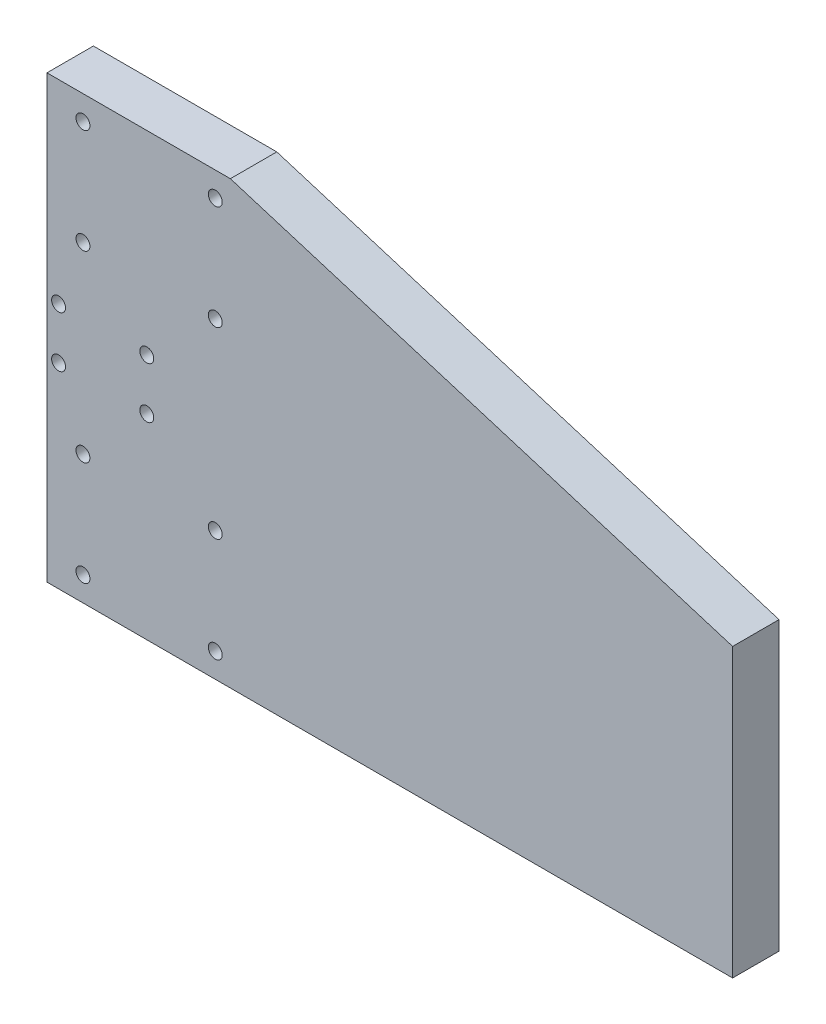
ISO-10303-21;
HEADER;
FILE_DESCRIPTION(('STEP AP214'),'2;1');
FILE_NAME('part.step','',(''),(''),'','','');
FILE_SCHEMA(('AUTOMOTIVE_DESIGN { 1 0 10303 214 1 1 1 1 }'));
ENDSEC;
DATA;
#1=APPLICATION_CONTEXT('core data for automotive mechanical design processes');
#2=APPLICATION_PROTOCOL_DEFINITION('international standard','automotive_design',2000,#1);
#3=PRODUCT_CONTEXT('',#1,'mechanical');
#4=PRODUCT('Part','Part','',(#3));
#5=PRODUCT_RELATED_PRODUCT_CATEGORY('part','',(#4));
#6=PRODUCT_DEFINITION_FORMATION('','',#4);
#7=PRODUCT_DEFINITION_CONTEXT('part definition',#1,'design');
#8=PRODUCT_DEFINITION('design','',#6,#7);
#9=PRODUCT_DEFINITION_SHAPE('','',#8);
#10=(LENGTH_UNIT() NAMED_UNIT(*) SI_UNIT(.MILLI.,.METRE.));
#11=(NAMED_UNIT(*) PLANE_ANGLE_UNIT() SI_UNIT($,.RADIAN.));
#12=(NAMED_UNIT(*) SI_UNIT($,.STERADIAN.) SOLID_ANGLE_UNIT());
#13=UNCERTAINTY_MEASURE_WITH_UNIT(LENGTH_MEASURE(1.E-05),#10,'distance_accuracy_value','');
#14=(GEOMETRIC_REPRESENTATION_CONTEXT(3) GLOBAL_UNCERTAINTY_ASSIGNED_CONTEXT((#13)) GLOBAL_UNIT_ASSIGNED_CONTEXT((#10,
#11,#12)) REPRESENTATION_CONTEXT('',''));
#15=CARTESIAN_POINT('',(0.,0.,0.));
#16=DIRECTION('',(0.,0.,1.));
#17=DIRECTION('',(1.,0.,0.));
#18=AXIS2_PLACEMENT_3D('',#15,#16,#17);
#19=CARTESIAN_POINT('',(251.346408251145,-63.9999999999088,20.));
#20=DIRECTION('',(-1.,0.,0.));
#21=DIRECTION('',(0.,0.,1.));
#22=AXIS2_PLACEMENT_3D('',#19,#20,#21);
#23=PLANE('',#22);
#24=DIRECTION('',(0.,1.,0.));
#25=VECTOR('',#24,1.);
#26=CARTESIAN_POINT('',(251.346408251145,-63.9999999999088,0.));
#27=LINE('',#26,#25);
#28=CARTESIAN_POINT('',(251.346408251145,-63.9999999999088,0.));
#29=VERTEX_POINT('',#28);
#30=CARTESIAN_POINT('',(251.346408251145,59.694869442643,0.));
#31=VERTEX_POINT('',#30);
#32=EDGE_CURVE('E111',#29,#31,#27,.T.);
#33=ORIENTED_EDGE('',*,*,#32,.T.);
#34=DIRECTION('',(0.,0.,-1.));
#35=VECTOR('',#34,1.);
#36=CARTESIAN_POINT('',(251.346408251145,59.694869442643,20.));
#37=LINE('',#36,#35);
#38=CARTESIAN_POINT('',(251.346408251145,59.694869442643,20.));
#39=VERTEX_POINT('',#38);
#40=EDGE_CURVE('E41',#39,#31,#37,.T.);
#41=ORIENTED_EDGE('',*,*,#40,.F.);
#42=DIRECTION('',(0.,1.,0.));
#43=VECTOR('',#42,1.);
#44=CARTESIAN_POINT('',(251.346408251145,-63.9999999999088,20.));
#45=LINE('',#44,#43);
#46=CARTESIAN_POINT('',(251.346408251145,-63.9999999999088,20.));
#47=VERTEX_POINT('',#46);
#48=EDGE_CURVE('E84',#47,#39,#45,.T.);
#49=ORIENTED_EDGE('',*,*,#48,.F.);
#50=DIRECTION('',(0.,0.,-1.));
#51=VECTOR('',#50,1.);
#52=CARTESIAN_POINT('',(251.346408251145,-63.9999999999088,20.));
#53=LINE('',#52,#51);
#54=EDGE_CURVE('E11',#47,#29,#53,.T.);
#55=ORIENTED_EDGE('',*,*,#54,.T.);
#56=EDGE_LOOP('',(#33,#41,#49,#55));
#57=FACE_BOUND('',#56,.T.);
#58=ADVANCED_FACE('F33',(#57),#23,.F.);
#59=CARTESIAN_POINT('',(251.346408251145,59.694869442643,20.));
#60=DIRECTION('',(-0.293023926566103,-0.956105108479075,0.));
#61=DIRECTION('',(0.956105108479075,-0.293023926566103,0.));
#62=AXIS2_PLACEMENT_3D('',#59,#60,#61);
#63=PLANE('',#62);
#64=DIRECTION('',(-0.956105108479075,0.293023926566103,0.));
#65=VECTOR('',#64,1.);
#66=CARTESIAN_POINT('',(251.346408251145,59.694869442643,0.));
#67=LINE('',#66,#65);
#68=CARTESIAN_POINT('',(34.9999999995747,126.000000000091,0.));
#69=VERTEX_POINT('',#68);
#70=EDGE_CURVE('E100',#31,#69,#67,.T.);
#71=ORIENTED_EDGE('',*,*,#70,.T.);
#72=DIRECTION('',(0.,0.,-1.));
#73=VECTOR('',#72,1.);
#74=CARTESIAN_POINT('',(34.9999999995747,126.000000000091,20.));
#75=LINE('',#74,#73);
#76=CARTESIAN_POINT('',(34.9999999995747,126.000000000091,20.));
#77=VERTEX_POINT('',#76);
#78=EDGE_CURVE('E97',#77,#69,#75,.T.);
#79=ORIENTED_EDGE('',*,*,#78,.F.);
#80=DIRECTION('',(-0.956105108479075,0.293023926566103,0.));
#81=VECTOR('',#80,1.);
#82=CARTESIAN_POINT('',(251.346408251145,59.694869442643,20.));
#83=LINE('',#82,#81);
#84=EDGE_CURVE('E89',#39,#77,#83,.T.);
#85=ORIENTED_EDGE('',*,*,#84,.F.);
#86=ORIENTED_EDGE('',*,*,#40,.T.);
#87=EDGE_LOOP('',(#71,#79,#85,#86));
#88=FACE_BOUND('',#87,.T.);
#89=ADVANCED_FACE('F98',(#88),#63,.F.);
#90=CARTESIAN_POINT('',(-43.9999999973474,126.000000000092,20.));
#91=DIRECTION('',(0.,-1.,0.));
#92=DIRECTION('',(1.,0.,0.));
#93=AXIS2_PLACEMENT_3D('',#90,#91,#92);
#94=PLANE('',#93);
#95=DIRECTION('',(-1.,0.,0.));
#96=VECTOR('',#95,1.);
#97=CARTESIAN_POINT('',(-43.9999999973474,126.000000000092,0.));
#98=LINE('',#97,#96);
#99=CARTESIAN_POINT('',(-43.9999999973474,126.000000000092,0.));
#100=VERTEX_POINT('',#99);
#101=EDGE_CURVE('E70',#69,#100,#98,.T.);
#102=ORIENTED_EDGE('',*,*,#101,.T.);
#103=DIRECTION('',(0.,0.,-1.));
#104=VECTOR('',#103,1.);
#105=CARTESIAN_POINT('',(-43.9999999973474,126.000000000092,20.));
#106=LINE('',#105,#104);
#107=CARTESIAN_POINT('',(-43.9999999973474,126.000000000092,20.));
#108=VERTEX_POINT('',#107);
#109=EDGE_CURVE('E101',#108,#100,#106,.T.);
#110=ORIENTED_EDGE('',*,*,#109,.F.);
#111=DIRECTION('',(-1.,0.,0.));
#112=VECTOR('',#111,1.);
#113=CARTESIAN_POINT('',(-43.9999999973474,126.000000000092,20.));
#114=LINE('',#113,#112);
#115=EDGE_CURVE('E93',#77,#108,#114,.T.);
#116=ORIENTED_EDGE('',*,*,#115,.F.);
#117=ORIENTED_EDGE('',*,*,#78,.T.);
#118=EDGE_LOOP('',(#102,#110,#116,#117));
#119=FACE_BOUND('',#118,.T.);
#120=ADVANCED_FACE('F103',(#119),#94,.F.);
#121=CARTESIAN_POINT('',(-43.9999999973474,-63.9999999999088,20.));
#122=DIRECTION('',(1.,0.,0.));
#123=DIRECTION('',(0.,0.,-1.));
#124=AXIS2_PLACEMENT_3D('',#121,#122,#123);
#125=PLANE('',#124);
#126=DIRECTION('',(0.,-1.,0.));
#127=VECTOR('',#126,1.);
#128=CARTESIAN_POINT('',(-43.9999999973474,-63.9999999999088,0.));
#129=LINE('',#128,#127);
#130=CARTESIAN_POINT('',(-43.9999999973474,-63.9999999999088,0.));
#131=VERTEX_POINT('',#130);
#132=EDGE_CURVE('E77',#100,#131,#129,.T.);
#133=ORIENTED_EDGE('',*,*,#132,.T.);
#134=DIRECTION('',(0.,0.,-1.));
#135=VECTOR('',#134,1.);
#136=CARTESIAN_POINT('',(-43.9999999973474,-63.9999999999088,20.));
#137=LINE('',#136,#135);
#138=CARTESIAN_POINT('',(-43.9999999973474,-63.9999999999088,20.));
#139=VERTEX_POINT('',#138);
#140=EDGE_CURVE('E107',#139,#131,#137,.T.);
#141=ORIENTED_EDGE('',*,*,#140,.F.);
#142=DIRECTION('',(0.,-1.,0.));
#143=VECTOR('',#142,1.);
#144=CARTESIAN_POINT('',(-43.9999999973474,-63.9999999999088,20.));
#145=LINE('',#144,#143);
#146=EDGE_CURVE('E105',#108,#139,#145,.T.);
#147=ORIENTED_EDGE('',*,*,#146,.F.);
#148=ORIENTED_EDGE('',*,*,#109,.T.);
#149=EDGE_LOOP('',(#133,#141,#147,#148));
#150=FACE_BOUND('',#149,.T.);
#151=ADVANCED_FACE('F125',(#150),#125,.F.);
#152=CARTESIAN_POINT('',(34.9999999996149,-63.9999999999088,20.));
#153=DIRECTION('',(0.,1.,0.));
#154=DIRECTION('',(-1.,0.,0.));
#155=AXIS2_PLACEMENT_3D('',#152,#153,#154);
#156=PLANE('',#155);
#157=DIRECTION('',(1.,0.,0.));
#158=VECTOR('',#157,1.);
#159=CARTESIAN_POINT('',(34.9999999996149,-63.9999999999088,0.));
#160=LINE('',#159,#158);
#161=EDGE_CURVE('E117',#131,#29,#160,.T.);
#162=ORIENTED_EDGE('',*,*,#161,.T.);
#163=ORIENTED_EDGE('',*,*,#54,.F.);
#164=DIRECTION('',(1.,0.,0.));
#165=VECTOR('',#164,1.);
#166=CARTESIAN_POINT('',(34.9999999996149,-63.9999999999088,20.));
#167=LINE('',#166,#165);
#168=EDGE_CURVE('E49',#139,#47,#167,.T.);
#169=ORIENTED_EDGE('',*,*,#168,.F.);
#170=ORIENTED_EDGE('',*,*,#140,.T.);
#171=EDGE_LOOP('',(#162,#163,#169,#170));
#172=FACE_BOUND('',#171,.T.);
#173=ADVANCED_FACE('F124',(#172),#156,.F.);
#174=CARTESIAN_POINT('',(0.,0.,20.));
#175=DIRECTION('',(0.,0.,1.));
#176=DIRECTION('',(1.,0.,0.));
#177=AXIS2_PLACEMENT_3D('',#174,#175,#176);
#178=PLANE('',#177);
#179=CARTESIAN_POINT('',(-0.99999999735392,42.3000000000959,20.));
#180=DIRECTION('',(0.,0.,1.));
#181=DIRECTION('',(1.,0.,0.));
#182=AXIS2_PLACEMENT_3D('',#179,#180,#181);
#183=CIRCLE('',#182,2.99999999996819);
#184=CARTESIAN_POINT('',(2.00000000261427,42.3000000000959,20.));
#185=VERTEX_POINT('',#184);
#186=EDGE_CURVE('E194',#185,#185,#183,.T.);
#187=ORIENTED_EDGE('',*,*,#186,.F.);
#188=EDGE_LOOP('',(#187));
#189=FACE_BOUND('',#188,.T.);
#190=CARTESIAN_POINT('',(-0.999999997353923,20.3000000000959,20.));
#191=DIRECTION('',(0.,0.,1.));
#192=DIRECTION('',(1.,0.,0.));
#193=AXIS2_PLACEMENT_3D('',#190,#191,#192);
#194=CIRCLE('',#193,2.99999999996808);
#195=CARTESIAN_POINT('',(2.00000000261416,20.3000000000959,20.));
#196=VERTEX_POINT('',#195);
#197=EDGE_CURVE('E188',#196,#196,#194,.T.);
#198=ORIENTED_EDGE('',*,*,#197,.F.);
#199=EDGE_LOOP('',(#198));
#200=FACE_BOUND('',#199,.T.);
#201=CARTESIAN_POINT('',(-38.9999999973539,42.3000000000959,20.));
#202=DIRECTION('',(0.,0.,1.));
#203=DIRECTION('',(1.,0.,0.));
#204=AXIS2_PLACEMENT_3D('',#201,#202,#203);
#205=CIRCLE('',#204,2.99999999996824);
#206=CARTESIAN_POINT('',(-35.9999999973857,42.3000000000959,20.));
#207=VERTEX_POINT('',#206);
#208=EDGE_CURVE('E182',#207,#207,#205,.T.);
#209=ORIENTED_EDGE('',*,*,#208,.F.);
#210=EDGE_LOOP('',(#209));
#211=FACE_BOUND('',#210,.T.);
#212=CARTESIAN_POINT('',(-38.9999999973539,20.3000000000959,20.));
#213=DIRECTION('',(0.,0.,1.));
#214=DIRECTION('',(1.,0.,0.));
#215=AXIS2_PLACEMENT_3D('',#212,#213,#214);
#216=CIRCLE('',#215,2.99999999996813);
#217=CARTESIAN_POINT('',(-35.9999999973858,20.3000000000959,20.));
#218=VERTEX_POINT('',#217);
#219=EDGE_CURVE('E176',#218,#218,#216,.T.);
#220=ORIENTED_EDGE('',*,*,#219,.F.);
#221=EDGE_LOOP('',(#220));
#222=FACE_BOUND('',#221,.T.);
#223=CARTESIAN_POINT('',(-28.5000000001122,70.5000000001109,20.));
#224=DIRECTION('',(0.,0.,1.));
#225=DIRECTION('',(1.,0.,0.));
#226=AXIS2_PLACEMENT_3D('',#223,#224,#225);
#227=CIRCLE('',#226,2.99999999997602);
#228=CARTESIAN_POINT('',(-25.5000000001362,70.5000000001109,20.));
#229=VERTEX_POINT('',#228);
#230=EDGE_CURVE('E170',#229,#229,#227,.T.);
#231=ORIENTED_EDGE('',*,*,#230,.F.);
#232=EDGE_LOOP('',(#231));
#233=FACE_BOUND('',#232,.T.);
#234=CARTESIAN_POINT('',(-28.5000000001133,115.50000000011,20.));
#235=DIRECTION('',(0.,0.,1.));
#236=DIRECTION('',(1.,0.,0.));
#237=AXIS2_PLACEMENT_3D('',#234,#235,#236);
#238=CIRCLE('',#237,2.99999999996359);
#239=CARTESIAN_POINT('',(-25.5000000001497,115.50000000011,20.));
#240=VERTEX_POINT('',#239);
#241=EDGE_CURVE('E164',#240,#240,#238,.T.);
#242=ORIENTED_EDGE('',*,*,#241,.F.);
#243=EDGE_LOOP('',(#242));
#244=FACE_BOUND('',#243,.T.);
#245=CARTESIAN_POINT('',(28.4999999998877,70.5000000001109,20.));
#246=DIRECTION('',(0.,0.,1.));
#247=DIRECTION('',(1.,0.,0.));
#248=AXIS2_PLACEMENT_3D('',#245,#246,#247);
#249=CIRCLE('',#248,2.99999999996158);
#250=CARTESIAN_POINT('',(31.4999999998493,70.5000000001109,20.));
#251=VERTEX_POINT('',#250);
#252=EDGE_CURVE('E158',#251,#251,#249,.T.);
#253=ORIENTED_EDGE('',*,*,#252,.F.);
#254=EDGE_LOOP('',(#253));
#255=FACE_BOUND('',#254,.T.);
#256=CARTESIAN_POINT('',(28.4999999998868,115.500000000111,20.));
#257=DIRECTION('',(0.,0.,1.));
#258=DIRECTION('',(1.,0.,0.));
#259=AXIS2_PLACEMENT_3D('',#256,#257,#258);
#260=CIRCLE('',#259,2.99999999996312);
#261=CARTESIAN_POINT('',(31.49999999985,115.500000000111,20.));
#262=VERTEX_POINT('',#261);
#263=EDGE_CURVE('E152',#262,#262,#260,.T.);
#264=ORIENTED_EDGE('',*,*,#263,.F.);
#265=EDGE_LOOP('',(#264));
#266=FACE_BOUND('',#265,.T.);
#267=CARTESIAN_POINT('',(28.4999999998843,-8.49999999990714,20.));
#268=DIRECTION('',(0.,0.,1.));
#269=DIRECTION('',(1.,0.,0.));
#270=AXIS2_PLACEMENT_3D('',#267,#268,#269);
#271=CIRCLE('',#270,2.9999999999457);
#272=CARTESIAN_POINT('',(31.49999999983,-8.49999999990714,20.));
#273=VERTEX_POINT('',#272);
#274=EDGE_CURVE('E146',#273,#273,#271,.T.);
#275=ORIENTED_EDGE('',*,*,#274,.F.);
#276=EDGE_LOOP('',(#275));
#277=FACE_BOUND('',#276,.T.);
#278=CARTESIAN_POINT('',(-28.5000000001158,-8.49999999990626,20.));
#279=DIRECTION('',(0.,0.,1.));
#280=DIRECTION('',(1.,0.,0.));
#281=AXIS2_PLACEMENT_3D('',#278,#279,#280);
#282=CIRCLE('',#281,2.99999999994544);
#283=CARTESIAN_POINT('',(-25.5000000001704,-8.49999999990626,20.));
#284=VERTEX_POINT('',#283);
#285=EDGE_CURVE('E140',#284,#284,#282,.T.);
#286=ORIENTED_EDGE('',*,*,#285,.F.);
#287=EDGE_LOOP('',(#286));
#288=FACE_BOUND('',#287,.T.);
#289=CARTESIAN_POINT('',(-28.5000000001156,-53.4999999999062,20.));
#290=DIRECTION('',(0.,0.,1.));
#291=DIRECTION('',(1.,0.,0.));
#292=AXIS2_PLACEMENT_3D('',#289,#290,#291);
#293=CIRCLE('',#292,2.99999999994528);
#294=CARTESIAN_POINT('',(-25.5000000001703,-53.4999999999062,20.));
#295=VERTEX_POINT('',#294);
#296=EDGE_CURVE('E134',#295,#295,#293,.T.);
#297=ORIENTED_EDGE('',*,*,#296,.F.);
#298=EDGE_LOOP('',(#297));
#299=FACE_BOUND('',#298,.T.);
#300=CARTESIAN_POINT('',(28.4999999998843,-53.4999999999071,20.));
#301=DIRECTION('',(0.,0.,1.));
#302=DIRECTION('',(1.,0.,0.));
#303=AXIS2_PLACEMENT_3D('',#300,#301,#302);
#304=CIRCLE('',#303,2.99999999994502);
#305=CARTESIAN_POINT('',(31.4999999998294,-53.4999999999071,20.));
#306=VERTEX_POINT('',#305);
#307=EDGE_CURVE('E128',#306,#306,#304,.T.);
#308=ORIENTED_EDGE('',*,*,#307,.F.);
#309=EDGE_LOOP('',(#308));
#310=FACE_BOUND('',#309,.T.);
#311=ORIENTED_EDGE('',*,*,#168,.T.);
#312=ORIENTED_EDGE('',*,*,#48,.T.);
#313=ORIENTED_EDGE('',*,*,#84,.T.);
#314=ORIENTED_EDGE('',*,*,#115,.T.);
#315=ORIENTED_EDGE('',*,*,#146,.T.);
#316=EDGE_LOOP('',(#311,#312,#313,#314,#315));
#317=FACE_BOUND('',#316,.T.);
#318=ADVANCED_FACE('F91',(#189,#200,#211,#222,#233,#244,#255,#266,#277,#288,#299,#310,#317),
#178,.T.);
#319=CARTESIAN_POINT('',(0.,0.,0.));
#320=DIRECTION('',(0.,0.,1.));
#321=DIRECTION('',(1.,0.,0.));
#322=AXIS2_PLACEMENT_3D('',#319,#320,#321);
#323=PLANE('',#322);
#324=CARTESIAN_POINT('',(-0.99999999735392,42.3000000000959,0.));
#325=DIRECTION('',(0.,0.,1.));
#326=DIRECTION('',(1.,0.,0.));
#327=AXIS2_PLACEMENT_3D('',#324,#325,#326);
#328=CIRCLE('',#327,2.99999999996819);
#329=CARTESIAN_POINT('',(2.00000000261427,42.3000000000959,0.));
#330=VERTEX_POINT('',#329);
#331=EDGE_CURVE('E191',#330,#330,#328,.T.);
#332=ORIENTED_EDGE('',*,*,#331,.T.);
#333=EDGE_LOOP('',(#332));
#334=FACE_BOUND('',#333,.T.);
#335=CARTESIAN_POINT('',(-0.999999997353923,20.3000000000959,0.));
#336=DIRECTION('',(0.,0.,1.));
#337=DIRECTION('',(1.,0.,0.));
#338=AXIS2_PLACEMENT_3D('',#335,#336,#337);
#339=CIRCLE('',#338,2.99999999996808);
#340=CARTESIAN_POINT('',(2.00000000261416,20.3000000000959,0.));
#341=VERTEX_POINT('',#340);
#342=EDGE_CURVE('E185',#341,#341,#339,.T.);
#343=ORIENTED_EDGE('',*,*,#342,.T.);
#344=EDGE_LOOP('',(#343));
#345=FACE_BOUND('',#344,.T.);
#346=CARTESIAN_POINT('',(-38.9999999973539,42.3000000000959,0.));
#347=DIRECTION('',(0.,0.,1.));
#348=DIRECTION('',(1.,0.,0.));
#349=AXIS2_PLACEMENT_3D('',#346,#347,#348);
#350=CIRCLE('',#349,2.99999999996824);
#351=CARTESIAN_POINT('',(-35.9999999973857,42.3000000000959,0.));
#352=VERTEX_POINT('',#351);
#353=EDGE_CURVE('E179',#352,#352,#350,.T.);
#354=ORIENTED_EDGE('',*,*,#353,.T.);
#355=EDGE_LOOP('',(#354));
#356=FACE_BOUND('',#355,.T.);
#357=CARTESIAN_POINT('',(-38.9999999973539,20.3000000000959,0.));
#358=DIRECTION('',(0.,0.,1.));
#359=DIRECTION('',(1.,0.,0.));
#360=AXIS2_PLACEMENT_3D('',#357,#358,#359);
#361=CIRCLE('',#360,2.99999999996813);
#362=CARTESIAN_POINT('',(-35.9999999973858,20.3000000000959,0.));
#363=VERTEX_POINT('',#362);
#364=EDGE_CURVE('E173',#363,#363,#361,.T.);
#365=ORIENTED_EDGE('',*,*,#364,.T.);
#366=EDGE_LOOP('',(#365));
#367=FACE_BOUND('',#366,.T.);
#368=CARTESIAN_POINT('',(-28.5000000001122,70.5000000001109,0.));
#369=DIRECTION('',(0.,0.,1.));
#370=DIRECTION('',(1.,0.,0.));
#371=AXIS2_PLACEMENT_3D('',#368,#369,#370);
#372=CIRCLE('',#371,2.99999999997602);
#373=CARTESIAN_POINT('',(-25.5000000001362,70.5000000001109,0.));
#374=VERTEX_POINT('',#373);
#375=EDGE_CURVE('E167',#374,#374,#372,.T.);
#376=ORIENTED_EDGE('',*,*,#375,.T.);
#377=EDGE_LOOP('',(#376));
#378=FACE_BOUND('',#377,.T.);
#379=CARTESIAN_POINT('',(-28.5000000001133,115.50000000011,0.));
#380=DIRECTION('',(0.,0.,1.));
#381=DIRECTION('',(1.,0.,0.));
#382=AXIS2_PLACEMENT_3D('',#379,#380,#381);
#383=CIRCLE('',#382,2.99999999996359);
#384=CARTESIAN_POINT('',(-25.5000000001497,115.50000000011,0.));
#385=VERTEX_POINT('',#384);
#386=EDGE_CURVE('E161',#385,#385,#383,.T.);
#387=ORIENTED_EDGE('',*,*,#386,.T.);
#388=EDGE_LOOP('',(#387));
#389=FACE_BOUND('',#388,.T.);
#390=CARTESIAN_POINT('',(28.4999999998877,70.5000000001109,0.));
#391=DIRECTION('',(0.,0.,1.));
#392=DIRECTION('',(1.,0.,0.));
#393=AXIS2_PLACEMENT_3D('',#390,#391,#392);
#394=CIRCLE('',#393,2.99999999996158);
#395=CARTESIAN_POINT('',(31.4999999998493,70.5000000001109,0.));
#396=VERTEX_POINT('',#395);
#397=EDGE_CURVE('E155',#396,#396,#394,.T.);
#398=ORIENTED_EDGE('',*,*,#397,.T.);
#399=EDGE_LOOP('',(#398));
#400=FACE_BOUND('',#399,.T.);
#401=CARTESIAN_POINT('',(28.4999999998868,115.500000000111,0.));
#402=DIRECTION('',(0.,0.,1.));
#403=DIRECTION('',(1.,0.,0.));
#404=AXIS2_PLACEMENT_3D('',#401,#402,#403);
#405=CIRCLE('',#404,2.99999999996312);
#406=CARTESIAN_POINT('',(31.49999999985,115.500000000111,0.));
#407=VERTEX_POINT('',#406);
#408=EDGE_CURVE('E149',#407,#407,#405,.T.);
#409=ORIENTED_EDGE('',*,*,#408,.T.);
#410=EDGE_LOOP('',(#409));
#411=FACE_BOUND('',#410,.T.);
#412=CARTESIAN_POINT('',(28.4999999998843,-8.49999999990714,0.));
#413=DIRECTION('',(0.,0.,1.));
#414=DIRECTION('',(1.,0.,0.));
#415=AXIS2_PLACEMENT_3D('',#412,#413,#414);
#416=CIRCLE('',#415,2.9999999999457);
#417=CARTESIAN_POINT('',(31.49999999983,-8.49999999990714,0.));
#418=VERTEX_POINT('',#417);
#419=EDGE_CURVE('E143',#418,#418,#416,.T.);
#420=ORIENTED_EDGE('',*,*,#419,.T.);
#421=EDGE_LOOP('',(#420));
#422=FACE_BOUND('',#421,.T.);
#423=CARTESIAN_POINT('',(-28.5000000001158,-8.49999999990626,0.));
#424=DIRECTION('',(0.,0.,1.));
#425=DIRECTION('',(1.,0.,0.));
#426=AXIS2_PLACEMENT_3D('',#423,#424,#425);
#427=CIRCLE('',#426,2.99999999994544);
#428=CARTESIAN_POINT('',(-25.5000000001704,-8.49999999990626,0.));
#429=VERTEX_POINT('',#428);
#430=EDGE_CURVE('E137',#429,#429,#427,.T.);
#431=ORIENTED_EDGE('',*,*,#430,.T.);
#432=EDGE_LOOP('',(#431));
#433=FACE_BOUND('',#432,.T.);
#434=CARTESIAN_POINT('',(-28.5000000001156,-53.4999999999062,0.));
#435=DIRECTION('',(0.,0.,1.));
#436=DIRECTION('',(1.,0.,0.));
#437=AXIS2_PLACEMENT_3D('',#434,#435,#436);
#438=CIRCLE('',#437,2.99999999994528);
#439=CARTESIAN_POINT('',(-25.5000000001703,-53.4999999999062,0.));
#440=VERTEX_POINT('',#439);
#441=EDGE_CURVE('E131',#440,#440,#438,.T.);
#442=ORIENTED_EDGE('',*,*,#441,.T.);
#443=EDGE_LOOP('',(#442));
#444=FACE_BOUND('',#443,.T.);
#445=CARTESIAN_POINT('',(28.4999999998843,-53.4999999999071,0.));
#446=DIRECTION('',(0.,0.,1.));
#447=DIRECTION('',(1.,0.,0.));
#448=AXIS2_PLACEMENT_3D('',#445,#446,#447);
#449=CIRCLE('',#448,2.99999999994502);
#450=CARTESIAN_POINT('',(31.4999999998294,-53.4999999999071,0.));
#451=VERTEX_POINT('',#450);
#452=EDGE_CURVE('E113',#451,#451,#449,.T.);
#453=ORIENTED_EDGE('',*,*,#452,.T.);
#454=EDGE_LOOP('',(#453));
#455=FACE_BOUND('',#454,.T.);
#456=ORIENTED_EDGE('',*,*,#32,.F.);
#457=ORIENTED_EDGE('',*,*,#161,.F.);
#458=ORIENTED_EDGE('',*,*,#132,.F.);
#459=ORIENTED_EDGE('',*,*,#101,.F.);
#460=ORIENTED_EDGE('',*,*,#70,.F.);
#461=EDGE_LOOP('',(#456,#457,#458,#459,#460));
#462=FACE_BOUND('',#461,.T.);
#463=ADVANCED_FACE('F122',(#334,#345,#356,#367,#378,#389,#400,#411,#422,#433,#444,#455,#462),
#323,.F.);
#464=CARTESIAN_POINT('',(28.4999999998843,-53.4999999999071,0.));
#465=DIRECTION('',(0.,0.,1.));
#466=DIRECTION('',(1.,0.,0.));
#467=AXIS2_PLACEMENT_3D('',#464,#465,#466);
#468=CYLINDRICAL_SURFACE('',#467,2.99999999994502);
#469=ORIENTED_EDGE('',*,*,#452,.F.);
#470=EDGE_LOOP('',(#469));
#471=FACE_BOUND('',#470,.T.);
#472=ORIENTED_EDGE('',*,*,#307,.T.);
#473=EDGE_LOOP('',(#472));
#474=FACE_BOUND('',#473,.T.);
#475=ADVANCED_FACE('F234',(#471,#474),#468,.F.);
#476=CARTESIAN_POINT('',(-28.5000000001156,-53.4999999999062,0.));
#477=DIRECTION('',(0.,0.,1.));
#478=DIRECTION('',(1.,0.,0.));
#479=AXIS2_PLACEMENT_3D('',#476,#477,#478);
#480=CYLINDRICAL_SURFACE('',#479,2.99999999994528);
#481=ORIENTED_EDGE('',*,*,#441,.F.);
#482=EDGE_LOOP('',(#481));
#483=FACE_BOUND('',#482,.T.);
#484=ORIENTED_EDGE('',*,*,#296,.T.);
#485=EDGE_LOOP('',(#484));
#486=FACE_BOUND('',#485,.T.);
#487=ADVANCED_FACE('F236',(#483,#486),#480,.F.);
#488=CARTESIAN_POINT('',(-28.5000000001158,-8.49999999990626,0.));
#489=DIRECTION('',(0.,0.,1.));
#490=DIRECTION('',(1.,0.,0.));
#491=AXIS2_PLACEMENT_3D('',#488,#489,#490);
#492=CYLINDRICAL_SURFACE('',#491,2.99999999994544);
#493=ORIENTED_EDGE('',*,*,#430,.F.);
#494=EDGE_LOOP('',(#493));
#495=FACE_BOUND('',#494,.T.);
#496=ORIENTED_EDGE('',*,*,#285,.T.);
#497=EDGE_LOOP('',(#496));
#498=FACE_BOUND('',#497,.T.);
#499=ADVANCED_FACE('F243',(#495,#498),#492,.F.);
#500=CARTESIAN_POINT('',(28.4999999998843,-8.49999999990714,0.));
#501=DIRECTION('',(0.,0.,1.));
#502=DIRECTION('',(1.,0.,0.));
#503=AXIS2_PLACEMENT_3D('',#500,#501,#502);
#504=CYLINDRICAL_SURFACE('',#503,2.9999999999457);
#505=ORIENTED_EDGE('',*,*,#419,.F.);
#506=EDGE_LOOP('',(#505));
#507=FACE_BOUND('',#506,.T.);
#508=ORIENTED_EDGE('',*,*,#274,.T.);
#509=EDGE_LOOP('',(#508));
#510=FACE_BOUND('',#509,.T.);
#511=ADVANCED_FACE('F291',(#507,#510),#504,.F.);
#512=CARTESIAN_POINT('',(28.4999999998868,115.500000000111,0.));
#513=DIRECTION('',(0.,0.,1.));
#514=DIRECTION('',(1.,0.,0.));
#515=AXIS2_PLACEMENT_3D('',#512,#513,#514);
#516=CYLINDRICAL_SURFACE('',#515,2.99999999996312);
#517=ORIENTED_EDGE('',*,*,#408,.F.);
#518=EDGE_LOOP('',(#517));
#519=FACE_BOUND('',#518,.T.);
#520=ORIENTED_EDGE('',*,*,#263,.T.);
#521=EDGE_LOOP('',(#520));
#522=FACE_BOUND('',#521,.T.);
#523=ADVANCED_FACE('F301',(#519,#522),#516,.F.);
#524=CARTESIAN_POINT('',(28.4999999998877,70.5000000001109,0.));
#525=DIRECTION('',(0.,0.,1.));
#526=DIRECTION('',(1.,0.,0.));
#527=AXIS2_PLACEMENT_3D('',#524,#525,#526);
#528=CYLINDRICAL_SURFACE('',#527,2.99999999996158);
#529=ORIENTED_EDGE('',*,*,#397,.F.);
#530=EDGE_LOOP('',(#529));
#531=FACE_BOUND('',#530,.T.);
#532=ORIENTED_EDGE('',*,*,#252,.T.);
#533=EDGE_LOOP('',(#532));
#534=FACE_BOUND('',#533,.T.);
#535=ADVANCED_FACE('F311',(#531,#534),#528,.F.);
#536=CARTESIAN_POINT('',(-28.5000000001133,115.50000000011,0.));
#537=DIRECTION('',(0.,0.,1.));
#538=DIRECTION('',(1.,0.,0.));
#539=AXIS2_PLACEMENT_3D('',#536,#537,#538);
#540=CYLINDRICAL_SURFACE('',#539,2.99999999996359);
#541=ORIENTED_EDGE('',*,*,#386,.F.);
#542=EDGE_LOOP('',(#541));
#543=FACE_BOUND('',#542,.T.);
#544=ORIENTED_EDGE('',*,*,#241,.T.);
#545=EDGE_LOOP('',(#544));
#546=FACE_BOUND('',#545,.T.);
#547=ADVANCED_FACE('F321',(#543,#546),#540,.F.);
#548=CARTESIAN_POINT('',(-28.5000000001122,70.5000000001109,0.));
#549=DIRECTION('',(0.,0.,1.));
#550=DIRECTION('',(1.,0.,0.));
#551=AXIS2_PLACEMENT_3D('',#548,#549,#550);
#552=CYLINDRICAL_SURFACE('',#551,2.99999999997602);
#553=ORIENTED_EDGE('',*,*,#375,.F.);
#554=EDGE_LOOP('',(#553));
#555=FACE_BOUND('',#554,.T.);
#556=ORIENTED_EDGE('',*,*,#230,.T.);
#557=EDGE_LOOP('',(#556));
#558=FACE_BOUND('',#557,.T.);
#559=ADVANCED_FACE('F331',(#555,#558),#552,.F.);
#560=CARTESIAN_POINT('',(-38.9999999973539,20.3000000000959,0.));
#561=DIRECTION('',(0.,0.,1.));
#562=DIRECTION('',(1.,0.,0.));
#563=AXIS2_PLACEMENT_3D('',#560,#561,#562);
#564=CYLINDRICAL_SURFACE('',#563,2.99999999996813);
#565=ORIENTED_EDGE('',*,*,#364,.F.);
#566=EDGE_LOOP('',(#565));
#567=FACE_BOUND('',#566,.T.);
#568=ORIENTED_EDGE('',*,*,#219,.T.);
#569=EDGE_LOOP('',(#568));
#570=FACE_BOUND('',#569,.T.);
#571=ADVANCED_FACE('F341',(#567,#570),#564,.F.);
#572=CARTESIAN_POINT('',(-38.9999999973539,42.3000000000959,0.));
#573=DIRECTION('',(0.,0.,1.));
#574=DIRECTION('',(1.,0.,0.));
#575=AXIS2_PLACEMENT_3D('',#572,#573,#574);
#576=CYLINDRICAL_SURFACE('',#575,2.99999999996824);
#577=ORIENTED_EDGE('',*,*,#353,.F.);
#578=EDGE_LOOP('',(#577));
#579=FACE_BOUND('',#578,.T.);
#580=ORIENTED_EDGE('',*,*,#208,.T.);
#581=EDGE_LOOP('',(#580));
#582=FACE_BOUND('',#581,.T.);
#583=ADVANCED_FACE('F351',(#579,#582),#576,.F.);
#584=CARTESIAN_POINT('',(-0.999999997353923,20.3000000000959,0.));
#585=DIRECTION('',(0.,0.,1.));
#586=DIRECTION('',(1.,0.,0.));
#587=AXIS2_PLACEMENT_3D('',#584,#585,#586);
#588=CYLINDRICAL_SURFACE('',#587,2.99999999996808);
#589=ORIENTED_EDGE('',*,*,#342,.F.);
#590=EDGE_LOOP('',(#589));
#591=FACE_BOUND('',#590,.T.);
#592=ORIENTED_EDGE('',*,*,#197,.T.);
#593=EDGE_LOOP('',(#592));
#594=FACE_BOUND('',#593,.T.);
#595=ADVANCED_FACE('F205',(#591,#594),#588,.F.);
#596=CARTESIAN_POINT('',(-0.99999999735392,42.3000000000959,0.));
#597=DIRECTION('',(0.,0.,1.));
#598=DIRECTION('',(1.,0.,0.));
#599=AXIS2_PLACEMENT_3D('',#596,#597,#598);
#600=CYLINDRICAL_SURFACE('',#599,2.99999999996819);
#601=ORIENTED_EDGE('',*,*,#331,.F.);
#602=EDGE_LOOP('',(#601));
#603=FACE_BOUND('',#602,.T.);
#604=ORIENTED_EDGE('',*,*,#186,.T.);
#605=EDGE_LOOP('',(#604));
#606=FACE_BOUND('',#605,.T.);
#607=ADVANCED_FACE('F202',(#603,#606),#600,.F.);
#608=CLOSED_SHELL('',(#58,#89,#120,#151,#173,#318,#463,#475,#487,#499,#511,#523,#535,#547,#559,
#571,#583,#595,#607));
#609=MANIFOLD_SOLID_BREP('B2',#608);
#610=ADVANCED_BREP_SHAPE_REPRESENTATION('',(#18,#609),#14);
#611=SHAPE_DEFINITION_REPRESENTATION(#9,#610);
ENDSEC;
END-ISO-10303-21;
